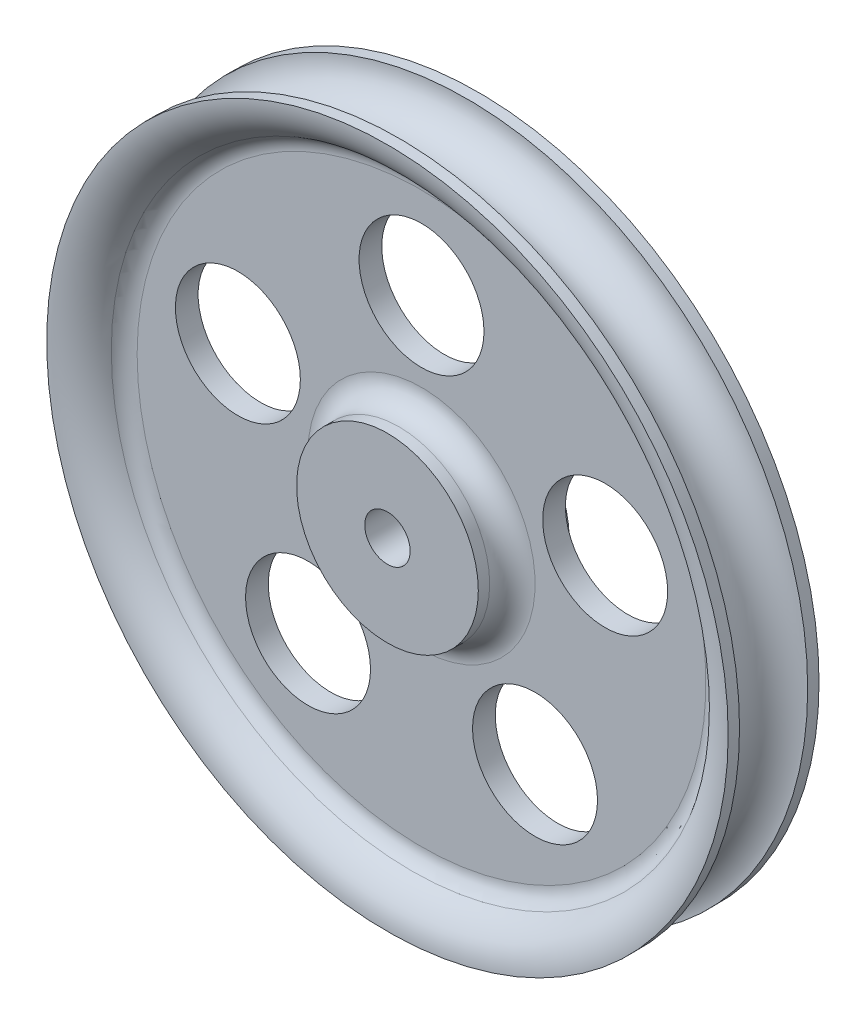
ISO-10303-21;
HEADER;
FILE_DESCRIPTION(('STEP AP214'),'2;1');
FILE_NAME('part.step','',(''),(''),'','','');
FILE_SCHEMA(('AUTOMOTIVE_DESIGN { 1 0 10303 214 1 1 1 1 }'));
ENDSEC;
DATA;
#1=APPLICATION_CONTEXT('core data for automotive mechanical design processes');
#2=APPLICATION_PROTOCOL_DEFINITION('international standard','automotive_design',2000,#1);
#3=PRODUCT_CONTEXT('',#1,'mechanical');
#4=PRODUCT('Part','Part','',(#3));
#5=PRODUCT_RELATED_PRODUCT_CATEGORY('part','',(#4));
#6=PRODUCT_DEFINITION_FORMATION('','',#4);
#7=PRODUCT_DEFINITION_CONTEXT('part definition',#1,'design');
#8=PRODUCT_DEFINITION('design','',#6,#7);
#9=PRODUCT_DEFINITION_SHAPE('','',#8);
#10=(LENGTH_UNIT() NAMED_UNIT(*) SI_UNIT(.MILLI.,.METRE.));
#11=(NAMED_UNIT(*) PLANE_ANGLE_UNIT() SI_UNIT($,.RADIAN.));
#12=(NAMED_UNIT(*) SI_UNIT($,.STERADIAN.) SOLID_ANGLE_UNIT());
#13=UNCERTAINTY_MEASURE_WITH_UNIT(LENGTH_MEASURE(1.E-05),#10,'distance_accuracy_value','');
#14=(GEOMETRIC_REPRESENTATION_CONTEXT(3) GLOBAL_UNCERTAINTY_ASSIGNED_CONTEXT((#13)) GLOBAL_UNIT_ASSIGNED_CONTEXT((#10,
#11,#12)) REPRESENTATION_CONTEXT('',''));
#15=CARTESIAN_POINT('',(0.,0.,0.));
#16=DIRECTION('',(0.,0.,1.));
#17=DIRECTION('',(1.,0.,0.));
#18=AXIS2_PLACEMENT_3D('',#15,#16,#17);
#19=CARTESIAN_POINT('',(0.,0.,136.652714825795));
#20=DIRECTION('',(0.,0.,1.));
#21=DIRECTION('',(1.,0.,0.));
#22=AXIS2_PLACEMENT_3D('',#19,#20,#21);
#23=CYLINDRICAL_SURFACE('',#22,50.8);
#24=CARTESIAN_POINT('',(0.,0.,19.05));
#25=DIRECTION('',(0.,0.,-1.));
#26=DIRECTION('',(-1.,0.,0.));
#27=AXIS2_PLACEMENT_3D('',#24,#25,#26);
#28=CIRCLE('',#27,50.8);
#29=CARTESIAN_POINT('',(-50.8,0.,19.05));
#30=VERTEX_POINT('',#29);
#31=EDGE_CURVE('E49',#30,#30,#28,.F.);
#32=ORIENTED_EDGE('',*,*,#31,.T.);
#33=EDGE_LOOP('',(#32));
#34=FACE_BOUND('',#33,.T.);
#35=CARTESIAN_POINT('',(0.,0.,25.4));
#36=DIRECTION('',(0.,0.,1.));
#37=DIRECTION('',(1.,0.,0.));
#38=AXIS2_PLACEMENT_3D('',#35,#36,#37);
#39=CIRCLE('',#38,50.8);
#40=CARTESIAN_POINT('',(50.8,0.,25.4));
#41=VERTEX_POINT('',#40);
#42=EDGE_CURVE('E66',#41,#41,#39,.T.);
#43=ORIENTED_EDGE('',*,*,#42,.F.);
#44=EDGE_LOOP('',(#43));
#45=FACE_BOUND('',#44,.T.);
#46=ADVANCED_FACE('F34',(#34,#45),#23,.T.);
#47=CARTESIAN_POINT('',(0.,12.7,25.4));
#48=DIRECTION('',(0.,0.,-1.));
#49=DIRECTION('',(-1.,0.,0.));
#50=AXIS2_PLACEMENT_3D('',#47,#48,#49);
#51=PLANE('',#50);
#52=CARTESIAN_POINT('',(0.,0.,25.4));
#53=DIRECTION('',(0.,0.,1.));
#54=DIRECTION('',(1.,0.,0.));
#55=AXIS2_PLACEMENT_3D('',#52,#53,#54);
#56=CIRCLE('',#55,12.7);
#57=CARTESIAN_POINT('',(12.7,0.,25.4));
#58=VERTEX_POINT('',#57);
#59=EDGE_CURVE('E69',#58,#58,#56,.T.);
#60=ORIENTED_EDGE('',*,*,#59,.F.);
#61=EDGE_LOOP('',(#60));
#62=FACE_BOUND('',#61,.T.);
#63=ORIENTED_EDGE('',*,*,#42,.T.);
#64=EDGE_LOOP('',(#63));
#65=FACE_BOUND('',#64,.T.);
#66=ADVANCED_FACE('F157',(#62,#65),#51,.F.);
#67=CARTESIAN_POINT('',(0.,0.,136.652714825795));
#68=DIRECTION('',(0.,0.,1.));
#69=DIRECTION('',(1.,0.,0.));
#70=AXIS2_PLACEMENT_3D('',#67,#68,#69);
#71=CYLINDRICAL_SURFACE('',#70,12.7);
#72=CARTESIAN_POINT('',(0.,0.,-25.4));
#73=DIRECTION('',(0.,0.,1.));
#74=DIRECTION('',(1.,0.,0.));
#75=AXIS2_PLACEMENT_3D('',#72,#73,#74);
#76=CIRCLE('',#75,12.7);
#77=CARTESIAN_POINT('',(12.7,0.,-25.4));
#78=VERTEX_POINT('',#77);
#79=EDGE_CURVE('E72',#78,#78,#76,.T.);
#80=ORIENTED_EDGE('',*,*,#79,.F.);
#81=EDGE_LOOP('',(#80));
#82=FACE_BOUND('',#81,.T.);
#83=ORIENTED_EDGE('',*,*,#59,.T.);
#84=EDGE_LOOP('',(#83));
#85=FACE_BOUND('',#84,.T.);
#86=ADVANCED_FACE('F163',(#82,#85),#71,.F.);
#87=CARTESIAN_POINT('',(0.,12.7,-25.4));
#88=DIRECTION('',(0.,0.,1.));
#89=DIRECTION('',(1.,0.,0.));
#90=AXIS2_PLACEMENT_3D('',#87,#88,#89);
#91=PLANE('',#90);
#92=CARTESIAN_POINT('',(0.,0.,-25.4000000000001));
#93=DIRECTION('',(0.,0.,1.));
#94=DIRECTION('',(1.,0.,0.));
#95=AXIS2_PLACEMENT_3D('',#92,#93,#94);
#96=CIRCLE('',#95,50.8);
#97=CARTESIAN_POINT('',(50.8,0.,-25.4000000000001));
#98=VERTEX_POINT('',#97);
#99=EDGE_CURVE('E75',#98,#98,#96,.T.);
#100=ORIENTED_EDGE('',*,*,#99,.F.);
#101=EDGE_LOOP('',(#100));
#102=FACE_BOUND('',#101,.T.);
#103=ORIENTED_EDGE('',*,*,#79,.T.);
#104=EDGE_LOOP('',(#103));
#105=FACE_BOUND('',#104,.T.);
#106=ADVANCED_FACE('F153',(#102,#105),#91,.F.);
#107=CARTESIAN_POINT('',(0.,0.,136.652714825795));
#108=DIRECTION('',(0.,0.,1.));
#109=DIRECTION('',(1.,0.,0.));
#110=AXIS2_PLACEMENT_3D('',#107,#108,#109);
#111=CYLINDRICAL_SURFACE('',#110,50.8);
#112=CARTESIAN_POINT('',(0.,0.,-19.05));
#113=DIRECTION('',(0.,0.,1.));
#114=DIRECTION('',(1.,0.,0.));
#115=AXIS2_PLACEMENT_3D('',#112,#113,#114);
#116=CIRCLE('',#115,50.8);
#117=CARTESIAN_POINT('',(50.8,0.,-19.05));
#118=VERTEX_POINT('',#117);
#119=EDGE_CURVE('E10',#118,#118,#116,.F.);
#120=ORIENTED_EDGE('',*,*,#119,.T.);
#121=EDGE_LOOP('',(#120));
#122=FACE_BOUND('',#121,.T.);
#123=ORIENTED_EDGE('',*,*,#99,.T.);
#124=EDGE_LOOP('',(#123));
#125=FACE_BOUND('',#124,.T.);
#126=ADVANCED_FACE('F144',(#122,#125),#111,.T.);
#127=CARTESIAN_POINT('',(0.,50.8,-6.35000000000002));
#128=DIRECTION('',(0.,0.,1.));
#129=DIRECTION('',(1.,0.,0.));
#130=AXIS2_PLACEMENT_3D('',#127,#128,#129);
#131=PLANE('',#130);
#132=CARTESIAN_POINT('',(0.,0.,-6.35000000000002));
#133=DIRECTION('',(0.,0.,1.));
#134=DIRECTION('',(1.,0.,0.));
#135=AXIS2_PLACEMENT_3D('',#132,#133,#134);
#136=CIRCLE('',#135,63.5);
#137=CARTESIAN_POINT('',(63.5,0.,-6.35000000000002));
#138=VERTEX_POINT('',#137);
#139=EDGE_CURVE('E41',#138,#138,#136,.T.);
#140=ORIENTED_EDGE('',*,*,#139,.T.);
#141=EDGE_LOOP('',(#140));
#142=FACE_BOUND('',#141,.T.);
#143=CARTESIAN_POINT('',(0.,0.,-6.35000000000002));
#144=DIRECTION('',(0.,0.,1.));
#145=DIRECTION('',(1.,0.,0.));
#146=AXIS2_PLACEMENT_3D('',#143,#144,#145);
#147=CIRCLE('',#146,159.005024210201);
#148=CARTESIAN_POINT('',(159.005024210201,0.,-6.35000000000002));
#149=VERTEX_POINT('',#148);
#150=EDGE_CURVE('E60',#149,#149,#147,.F.);
#151=ORIENTED_EDGE('',*,*,#150,.T.);
#152=EDGE_LOOP('',(#151));
#153=FACE_BOUND('',#152,.T.);
#154=CARTESIAN_POINT('',(102.666550934061,33.3583845427767,-6.35000000000002));
#155=DIRECTION('',(0.,0.,1.));
#156=DIRECTION('',(1.,0.,0.));
#157=AXIS2_PLACEMENT_3D('',#154,#155,#156);
#158=CIRCLE('',#157,34.925);
#159=CARTESIAN_POINT('',(137.591550934061,33.3583845427767,-6.35000000000002));
#160=VERTEX_POINT('',#159);
#161=EDGE_CURVE('E96',#160,#160,#158,.T.);
#162=ORIENTED_EDGE('',*,*,#161,.T.);
#163=EDGE_LOOP('',(#162));
#164=FACE_BOUND('',#163,.T.);
#165=CARTESIAN_POINT('',(63.4514179849732,-87.333384542775,-6.35000000000002));
#166=DIRECTION('',(0.,0.,1.));
#167=DIRECTION('',(1.,0.,0.));
#168=AXIS2_PLACEMENT_3D('',#165,#166,#167);
#169=CIRCLE('',#168,34.925);
#170=CARTESIAN_POINT('',(98.3764179849732,-87.333384542775,-6.35000000000002));
#171=VERTEX_POINT('',#170);
#172=EDGE_CURVE('E99',#171,#171,#169,.T.);
#173=ORIENTED_EDGE('',*,*,#172,.T.);
#174=EDGE_LOOP('',(#173));
#175=FACE_BOUND('',#174,.T.);
#176=CARTESIAN_POINT('',(-63.451417984972,-87.3333845427759,-6.35000000000002));
#177=DIRECTION('',(0.,0.,1.));
#178=DIRECTION('',(1.,0.,0.));
#179=AXIS2_PLACEMENT_3D('',#176,#177,#178);
#180=CIRCLE('',#179,34.925);
#181=CARTESIAN_POINT('',(-28.526417984972,-87.3333845427759,-6.35000000000002));
#182=VERTEX_POINT('',#181);
#183=EDGE_CURVE('E102',#182,#182,#180,.T.);
#184=ORIENTED_EDGE('',*,*,#183,.T.);
#185=EDGE_LOOP('',(#184));
#186=FACE_BOUND('',#185,.T.);
#187=CARTESIAN_POINT('',(-102.666550934062,33.3583845427753,-6.35000000000002));
#188=DIRECTION('',(0.,0.,1.));
#189=DIRECTION('',(1.,0.,0.));
#190=AXIS2_PLACEMENT_3D('',#187,#188,#189);
#191=CIRCLE('',#190,34.925);
#192=CARTESIAN_POINT('',(-67.7415509340619,33.3583845427753,-6.35000000000002));
#193=VERTEX_POINT('',#192);
#194=EDGE_CURVE('E105',#193,#193,#191,.T.);
#195=ORIENTED_EDGE('',*,*,#194,.T.);
#196=EDGE_LOOP('',(#195));
#197=FACE_BOUND('',#196,.T.);
#198=CARTESIAN_POINT('',(0.,107.95,-6.35000000000002));
#199=DIRECTION('',(0.,0.,1.));
#200=DIRECTION('',(1.,0.,0.));
#201=AXIS2_PLACEMENT_3D('',#198,#199,#200);
#202=CIRCLE('',#201,34.925);
#203=CARTESIAN_POINT('',(34.925,107.95,-6.35000000000002));
#204=VERTEX_POINT('',#203);
#205=EDGE_CURVE('E90',#204,#204,#202,.T.);
#206=ORIENTED_EDGE('',*,*,#205,.T.);
#207=EDGE_LOOP('',(#206));
#208=FACE_BOUND('',#207,.T.);
#209=ADVANCED_FACE('F141',(#142,#153,#164,#175,#186,#197,#208),#131,.F.);
#210=CARTESIAN_POINT('',(0.,0.,0.));
#211=DIRECTION('',(0.,0.,1.));
#212=DIRECTION('',(1.,0.,0.));
#213=AXIS2_PLACEMENT_3D('',#210,#211,#212);
#214=TOROIDAL_SURFACE('',#213,190.5,25.4);
#215=CARTESIAN_POINT('',(0.,0.,-11.7928571428572));
#216=DIRECTION('',(0.,0.,1.));
#217=DIRECTION('',(1.,0.,0.));
#218=AXIS2_PLACEMENT_3D('',#215,#216,#217);
#219=CIRCLE('',#218,168.003588721572);
#220=CARTESIAN_POINT('',(168.003588721572,0.,-11.7928571428572));
#221=VERTEX_POINT('',#220);
#222=EDGE_CURVE('E63',#221,#221,#219,.T.);
#223=ORIENTED_EDGE('',*,*,#222,.T.);
#224=EDGE_LOOP('',(#223));
#225=FACE_BOUND('',#224,.T.);
#226=CARTESIAN_POINT('',(0.,0.,-25.4));
#227=DIRECTION('',(0.,0.,1.));
#228=DIRECTION('',(1.,0.,0.));
#229=AXIS2_PLACEMENT_3D('',#226,#227,#228);
#230=CIRCLE('',#229,190.5);
#231=CARTESIAN_POINT('',(190.5,0.,-25.4));
#232=VERTEX_POINT('',#231);
#233=EDGE_CURVE('E78',#232,#232,#230,.T.);
#234=ORIENTED_EDGE('',*,*,#233,.F.);
#235=EDGE_LOOP('',(#234));
#236=FACE_BOUND('',#235,.T.);
#237=ADVANCED_FACE('F143',(#225,#236),#214,.T.);
#238=CARTESIAN_POINT('',(0.,0.,136.652714825795));
#239=DIRECTION('',(0.,0.,1.));
#240=DIRECTION('',(1.,0.,0.));
#241=AXIS2_PLACEMENT_3D('',#238,#239,#240);
#242=CYLINDRICAL_SURFACE('',#241,190.5);
#243=CARTESIAN_POINT('',(0.,0.,-19.05));
#244=DIRECTION('',(0.,0.,1.));
#245=DIRECTION('',(1.,0.,0.));
#246=AXIS2_PLACEMENT_3D('',#243,#244,#245);
#247=CIRCLE('',#246,190.5);
#248=CARTESIAN_POINT('',(190.5,0.,-19.05));
#249=VERTEX_POINT('',#248);
#250=EDGE_CURVE('E81',#249,#249,#247,.T.);
#251=ORIENTED_EDGE('',*,*,#250,.F.);
#252=EDGE_LOOP('',(#251));
#253=FACE_BOUND('',#252,.T.);
#254=ORIENTED_EDGE('',*,*,#233,.T.);
#255=EDGE_LOOP('',(#254));
#256=FACE_BOUND('',#255,.T.);
#257=ADVANCED_FACE('F150',(#253,#256),#242,.T.);
#258=CARTESIAN_POINT('',(0.,0.,0.));
#259=DIRECTION('',(0.,0.,1.));
#260=DIRECTION('',(1.,0.,0.));
#261=AXIS2_PLACEMENT_3D('',#258,#259,#260);
#262=TOROIDAL_SURFACE('',#261,190.5,19.05);
#263=CARTESIAN_POINT('',(0.,0.,19.05));
#264=DIRECTION('',(0.,0.,1.));
#265=DIRECTION('',(1.,0.,0.));
#266=AXIS2_PLACEMENT_3D('',#263,#264,#265);
#267=CIRCLE('',#266,190.5);
#268=CARTESIAN_POINT('',(190.5,0.,19.05));
#269=VERTEX_POINT('',#268);
#270=EDGE_CURVE('E84',#269,#269,#267,.T.);
#271=ORIENTED_EDGE('',*,*,#270,.F.);
#272=EDGE_LOOP('',(#271));
#273=FACE_BOUND('',#272,.T.);
#274=ORIENTED_EDGE('',*,*,#250,.T.);
#275=EDGE_LOOP('',(#274));
#276=FACE_BOUND('',#275,.T.);
#277=ADVANCED_FACE('F220',(#273,#276),#262,.F.);
#278=CARTESIAN_POINT('',(0.,0.,136.652714825795));
#279=DIRECTION('',(0.,0.,1.));
#280=DIRECTION('',(1.,0.,0.));
#281=AXIS2_PLACEMENT_3D('',#278,#279,#280);
#282=CYLINDRICAL_SURFACE('',#281,190.5);
#283=CARTESIAN_POINT('',(0.,0.,25.4));
#284=DIRECTION('',(0.,0.,1.));
#285=DIRECTION('',(1.,0.,0.));
#286=AXIS2_PLACEMENT_3D('',#283,#284,#285);
#287=CIRCLE('',#286,190.5);
#288=CARTESIAN_POINT('',(190.5,0.,25.4));
#289=VERTEX_POINT('',#288);
#290=EDGE_CURVE('E87',#289,#289,#287,.T.);
#291=ORIENTED_EDGE('',*,*,#290,.F.);
#292=EDGE_LOOP('',(#291));
#293=FACE_BOUND('',#292,.T.);
#294=ORIENTED_EDGE('',*,*,#270,.T.);
#295=EDGE_LOOP('',(#294));
#296=FACE_BOUND('',#295,.T.);
#297=ADVANCED_FACE('F216',(#293,#296),#282,.T.);
#298=CARTESIAN_POINT('',(0.,0.,0.));
#299=DIRECTION('',(0.,0.,1.));
#300=DIRECTION('',(1.,0.,0.));
#301=AXIS2_PLACEMENT_3D('',#298,#299,#300);
#302=TOROIDAL_SURFACE('',#301,190.5,25.4);
#303=CARTESIAN_POINT('',(0.,0.,11.7928571428572));
#304=DIRECTION('',(0.,0.,-1.));
#305=DIRECTION('',(-1.,0.,0.));
#306=AXIS2_PLACEMENT_3D('',#303,#304,#305);
#307=CIRCLE('',#306,168.003588721572);
#308=CARTESIAN_POINT('',(-168.003588721572,0.,11.7928571428572));
#309=VERTEX_POINT('',#308);
#310=EDGE_CURVE('E54',#309,#309,#307,.T.);
#311=ORIENTED_EDGE('',*,*,#310,.T.);
#312=EDGE_LOOP('',(#311));
#313=FACE_BOUND('',#312,.T.);
#314=ORIENTED_EDGE('',*,*,#290,.T.);
#315=EDGE_LOOP('',(#314));
#316=FACE_BOUND('',#315,.T.);
#317=ADVANCED_FACE('F128',(#313,#316),#302,.T.);
#318=CARTESIAN_POINT('',(0.,50.8,6.35000000000001));
#319=DIRECTION('',(0.,0.,-1.));
#320=DIRECTION('',(-1.,0.,0.));
#321=AXIS2_PLACEMENT_3D('',#318,#319,#320);
#322=PLANE('',#321);
#323=CARTESIAN_POINT('',(0.,0.,6.35000000000001));
#324=DIRECTION('',(0.,0.,-1.));
#325=DIRECTION('',(-1.,0.,0.));
#326=AXIS2_PLACEMENT_3D('',#323,#324,#325);
#327=CIRCLE('',#326,63.5);
#328=CARTESIAN_POINT('',(-63.5,0.,6.35000000000001));
#329=VERTEX_POINT('',#328);
#330=EDGE_CURVE('E45',#329,#329,#327,.T.);
#331=ORIENTED_EDGE('',*,*,#330,.T.);
#332=EDGE_LOOP('',(#331));
#333=FACE_BOUND('',#332,.T.);
#334=CARTESIAN_POINT('',(0.,0.,6.35000000000001));
#335=DIRECTION('',(0.,0.,-1.));
#336=DIRECTION('',(-1.,0.,0.));
#337=AXIS2_PLACEMENT_3D('',#334,#335,#336);
#338=CIRCLE('',#337,159.005024210201);
#339=CARTESIAN_POINT('',(-159.005024210201,0.,6.35000000000001));
#340=VERTEX_POINT('',#339);
#341=EDGE_CURVE('E57',#340,#340,#338,.F.);
#342=ORIENTED_EDGE('',*,*,#341,.T.);
#343=EDGE_LOOP('',(#342));
#344=FACE_BOUND('',#343,.T.);
#345=CARTESIAN_POINT('',(102.666550934061,33.3583845427767,6.35000000000001));
#346=DIRECTION('',(0.,0.,1.));
#347=DIRECTION('',(0.309016994374958,-0.95105651629515,0.));
#348=AXIS2_PLACEMENT_3D('',#345,#346,#347);
#349=CIRCLE('',#348,34.925);
#350=CARTESIAN_POINT('',(113.458969462607,0.142735711168629,6.35000000000001));
#351=VERTEX_POINT('',#350);
#352=EDGE_CURVE('E112',#351,#351,#349,.T.);
#353=ORIENTED_EDGE('',*,*,#352,.F.);
#354=EDGE_LOOP('',(#353));
#355=FACE_BOUND('',#354,.T.);
#356=CARTESIAN_POINT('',(63.4514179849732,-87.333384542775,6.35000000000001));
#357=DIRECTION('',(0.,0.,1.));
#358=DIRECTION('',(-0.809016994374942,-0.58778525229248,0.));
#359=AXIS2_PLACEMENT_3D('',#356,#357,#358);
#360=CIRCLE('',#359,34.925);
#361=CARTESIAN_POINT('',(35.1964994564284,-107.86178447909,6.35000000000001));
#362=VERTEX_POINT('',#361);
#363=EDGE_CURVE('E115',#362,#362,#360,.T.);
#364=ORIENTED_EDGE('',*,*,#363,.F.);
#365=EDGE_LOOP('',(#364));
#366=FACE_BOUND('',#365,.T.);
#367=CARTESIAN_POINT('',(-63.451417984972,-87.3333845427759,6.35000000000001));
#368=DIRECTION('',(0.,0.,1.));
#369=DIRECTION('',(-0.809016994374951,0.587785252292469,0.));
#370=AXIS2_PLACEMENT_3D('',#367,#368,#369);
#371=CIRCLE('',#370,34.925);
#372=CARTESIAN_POINT('',(-91.7063365135171,-66.8049846064615,6.35000000000001));
#373=VERTEX_POINT('',#372);
#374=EDGE_CURVE('E111',#373,#373,#371,.T.);
#375=ORIENTED_EDGE('',*,*,#374,.F.);
#376=EDGE_LOOP('',(#375));
#377=FACE_BOUND('',#376,.T.);
#378=CARTESIAN_POINT('',(-102.666550934062,33.3583845427753,6.35000000000001));
#379=DIRECTION('',(0.,0.,1.));
#380=DIRECTION('',(0.309016994374945,0.951056516295155,0.));
#381=AXIS2_PLACEMENT_3D('',#378,#379,#380);
#382=CIRCLE('',#381,34.925);
#383=CARTESIAN_POINT('',(-91.874132405517,66.5740333743836,6.35000000000001));
#384=VERTEX_POINT('',#383);
#385=EDGE_CURVE('E108',#384,#384,#382,.T.);
#386=ORIENTED_EDGE('',*,*,#385,.F.);
#387=EDGE_LOOP('',(#386));
#388=FACE_BOUND('',#387,.T.);
#389=CARTESIAN_POINT('',(0.,107.95,6.35000000000001));
#390=DIRECTION('',(0.,0.,1.));
#391=DIRECTION('',(1.,0.,0.));
#392=AXIS2_PLACEMENT_3D('',#389,#390,#391);
#393=CIRCLE('',#392,34.925);
#394=CARTESIAN_POINT('',(34.925,107.95,6.35000000000001));
#395=VERTEX_POINT('',#394);
#396=EDGE_CURVE('E93',#395,#395,#393,.T.);
#397=ORIENTED_EDGE('',*,*,#396,.F.);
#398=EDGE_LOOP('',(#397));
#399=FACE_BOUND('',#398,.T.);
#400=ADVANCED_FACE('F124',(#333,#344,#355,#366,#377,#388,#399),#322,.F.);
#401=CARTESIAN_POINT('',(0.,107.95,-25.4000000000001));
#402=DIRECTION('',(0.,0.,1.));
#403=DIRECTION('',(1.,0.,0.));
#404=AXIS2_PLACEMENT_3D('',#401,#402,#403);
#405=CYLINDRICAL_SURFACE('',#404,34.925);
#406=ORIENTED_EDGE('',*,*,#396,.T.);
#407=EDGE_LOOP('',(#406));
#408=FACE_BOUND('',#407,.T.);
#409=ORIENTED_EDGE('',*,*,#205,.F.);
#410=EDGE_LOOP('',(#409));
#411=FACE_BOUND('',#410,.T.);
#412=ADVANCED_FACE('F127',(#408,#411),#405,.F.);
#413=CARTESIAN_POINT('',(-102.666550934062,33.3583845427753,-25.4000000000001));
#414=DIRECTION('',(0.,0.,1.));
#415=DIRECTION('',(1.,0.,0.));
#416=AXIS2_PLACEMENT_3D('',#413,#414,#415);
#417=CYLINDRICAL_SURFACE('',#416,34.925);
#418=ORIENTED_EDGE('',*,*,#385,.T.);
#419=EDGE_LOOP('',(#418));
#420=FACE_BOUND('',#419,.T.);
#421=ORIENTED_EDGE('',*,*,#194,.F.);
#422=EDGE_LOOP('',(#421));
#423=FACE_BOUND('',#422,.T.);
#424=ADVANCED_FACE('F137',(#420,#423),#417,.F.);
#425=CARTESIAN_POINT('',(-63.451417984972,-87.3333845427759,-25.4000000000001));
#426=DIRECTION('',(0.,0.,1.));
#427=DIRECTION('',(1.,0.,0.));
#428=AXIS2_PLACEMENT_3D('',#425,#426,#427);
#429=CYLINDRICAL_SURFACE('',#428,34.925);
#430=ORIENTED_EDGE('',*,*,#374,.T.);
#431=EDGE_LOOP('',(#430));
#432=FACE_BOUND('',#431,.T.);
#433=ORIENTED_EDGE('',*,*,#183,.F.);
#434=EDGE_LOOP('',(#433));
#435=FACE_BOUND('',#434,.T.);
#436=ADVANCED_FACE('F121',(#432,#435),#429,.F.);
#437=CARTESIAN_POINT('',(63.4514179849732,-87.333384542775,-25.4000000000001));
#438=DIRECTION('',(0.,0.,1.));
#439=DIRECTION('',(1.,0.,0.));
#440=AXIS2_PLACEMENT_3D('',#437,#438,#439);
#441=CYLINDRICAL_SURFACE('',#440,34.925);
#442=ORIENTED_EDGE('',*,*,#363,.T.);
#443=EDGE_LOOP('',(#442));
#444=FACE_BOUND('',#443,.T.);
#445=ORIENTED_EDGE('',*,*,#172,.F.);
#446=EDGE_LOOP('',(#445));
#447=FACE_BOUND('',#446,.T.);
#448=ADVANCED_FACE('F194',(#444,#447),#441,.F.);
#449=CARTESIAN_POINT('',(102.666550934061,33.3583845427767,-25.4000000000001));
#450=DIRECTION('',(0.,0.,1.));
#451=DIRECTION('',(1.,0.,0.));
#452=AXIS2_PLACEMENT_3D('',#449,#450,#451);
#453=CYLINDRICAL_SURFACE('',#452,34.925);
#454=ORIENTED_EDGE('',*,*,#352,.T.);
#455=EDGE_LOOP('',(#454));
#456=FACE_BOUND('',#455,.T.);
#457=ORIENTED_EDGE('',*,*,#161,.F.);
#458=EDGE_LOOP('',(#457));
#459=FACE_BOUND('',#458,.T.);
#460=ADVANCED_FACE('F173',(#456,#459),#453,.F.);
#461=CARTESIAN_POINT('',(0.,0.,-16.51));
#462=DIRECTION('',(0.,0.,-1.));
#463=DIRECTION('',(-1.,0.,0.));
#464=AXIS2_PLACEMENT_3D('',#461,#462,#463);
#465=TOROIDAL_SURFACE('',#464,159.005024210201,10.16);
#466=ORIENTED_EDGE('',*,*,#150,.F.);
#467=EDGE_LOOP('',(#466));
#468=FACE_BOUND('',#467,.T.);
#469=ORIENTED_EDGE('',*,*,#222,.F.);
#470=EDGE_LOOP('',(#469));
#471=FACE_BOUND('',#470,.T.);
#472=ADVANCED_FACE('F169',(#468,#471),#465,.F.);
#473=CARTESIAN_POINT('',(0.,0.,16.51));
#474=DIRECTION('',(0.,0.,1.));
#475=DIRECTION('',(1.,0.,0.));
#476=AXIS2_PLACEMENT_3D('',#473,#474,#475);
#477=TOROIDAL_SURFACE('',#476,159.005024210201,10.16);
#478=ORIENTED_EDGE('',*,*,#310,.F.);
#479=EDGE_LOOP('',(#478));
#480=FACE_BOUND('',#479,.T.);
#481=ORIENTED_EDGE('',*,*,#341,.F.);
#482=EDGE_LOOP('',(#481));
#483=FACE_BOUND('',#482,.T.);
#484=ADVANCED_FACE('F172',(#480,#483),#477,.F.);
#485=CARTESIAN_POINT('',(0.,0.,19.05));
#486=DIRECTION('',(0.,0.,-1.));
#487=DIRECTION('',(-1.,0.,0.));
#488=AXIS2_PLACEMENT_3D('',#485,#486,#487);
#489=TOROIDAL_SURFACE('',#488,63.5,12.7);
#490=ORIENTED_EDGE('',*,*,#330,.F.);
#491=EDGE_LOOP('',(#490));
#492=FACE_BOUND('',#491,.T.);
#493=ORIENTED_EDGE('',*,*,#31,.F.);
#494=EDGE_LOOP('',(#493));
#495=FACE_BOUND('',#494,.T.);
#496=ADVANCED_FACE('F176',(#492,#495),#489,.F.);
#497=CARTESIAN_POINT('',(0.,0.,-19.05));
#498=DIRECTION('',(0.,0.,1.));
#499=DIRECTION('',(1.,0.,0.));
#500=AXIS2_PLACEMENT_3D('',#497,#498,#499);
#501=TOROIDAL_SURFACE('',#500,63.5,12.7);
#502=ORIENTED_EDGE('',*,*,#119,.F.);
#503=EDGE_LOOP('',(#502));
#504=FACE_BOUND('',#503,.T.);
#505=ORIENTED_EDGE('',*,*,#139,.F.);
#506=EDGE_LOOP('',(#505));
#507=FACE_BOUND('',#506,.T.);
#508=ADVANCED_FACE('F36',(#504,#507),#501,.F.);
#509=CLOSED_SHELL('',(#46,#66,#86,#106,#126,#209,#237,#257,#277,#297,#317,#400,#412,#424,#436,
#448,#460,#472,#484,#496,#508));
#510=MANIFOLD_SOLID_BREP('B2',#509);
#511=ADVANCED_BREP_SHAPE_REPRESENTATION('',(#18,#510),#14);
#512=SHAPE_DEFINITION_REPRESENTATION(#9,#511);
ENDSEC;
END-ISO-10303-21;
